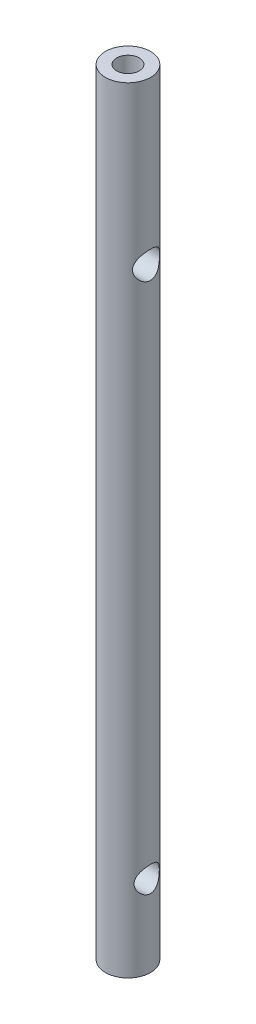
ISO-10303-21;
HEADER;
FILE_DESCRIPTION(('STEP AP214'),'2;1');
FILE_NAME('part.step','',(''),(''),'','','');
FILE_SCHEMA(('AUTOMOTIVE_DESIGN { 1 0 10303 214 1 1 1 1 }'));
ENDSEC;
DATA;
#1=APPLICATION_CONTEXT('core data for automotive mechanical design processes');
#2=APPLICATION_PROTOCOL_DEFINITION('international standard','automotive_design',2000,#1);
#3=PRODUCT_CONTEXT('',#1,'mechanical');
#4=PRODUCT('Part','Part','',(#3));
#5=PRODUCT_RELATED_PRODUCT_CATEGORY('part','',(#4));
#6=PRODUCT_DEFINITION_FORMATION('','',#4);
#7=PRODUCT_DEFINITION_CONTEXT('part definition',#1,'design');
#8=PRODUCT_DEFINITION('design','',#6,#7);
#9=PRODUCT_DEFINITION_SHAPE('','',#8);
#10=(LENGTH_UNIT() NAMED_UNIT(*) SI_UNIT(.MILLI.,.METRE.));
#11=(NAMED_UNIT(*) PLANE_ANGLE_UNIT() SI_UNIT($,.RADIAN.));
#12=(NAMED_UNIT(*) SI_UNIT($,.STERADIAN.) SOLID_ANGLE_UNIT());
#13=UNCERTAINTY_MEASURE_WITH_UNIT(LENGTH_MEASURE(1.E-05),#10,'distance_accuracy_value','');
#14=(GEOMETRIC_REPRESENTATION_CONTEXT(3) GLOBAL_UNCERTAINTY_ASSIGNED_CONTEXT((#13)) GLOBAL_UNIT_ASSIGNED_CONTEXT((#10,
#11,#12)) REPRESENTATION_CONTEXT('',''));
#15=CARTESIAN_POINT('',(0.,0.,0.));
#16=DIRECTION('',(0.,0.,1.));
#17=DIRECTION('',(1.,0.,0.));
#18=AXIS2_PLACEMENT_3D('',#15,#16,#17);
#19=CARTESIAN_POINT('',(0.,86.,0.));
#20=DIRECTION('',(0.,-1.,0.));
#21=DIRECTION('',(0.,0.,-1.));
#22=AXIS2_PLACEMENT_3D('',#19,#20,#21);
#23=CYLINDRICAL_SURFACE('',#22,2.5);
#24=CARTESIAN_POINT('',(0.,86.,0.));
#25=DIRECTION('',(0.,1.,0.));
#26=DIRECTION('',(0.,0.,1.));
#27=AXIS2_PLACEMENT_3D('',#24,#25,#26);
#28=CIRCLE('',#27,2.5);
#29=CARTESIAN_POINT('',(0.,86.,2.5));
#30=VERTEX_POINT('',#29);
#31=EDGE_CURVE('E11',#30,#30,#28,.T.);
#32=ORIENTED_EDGE('',*,*,#31,.F.);
#33=EDGE_LOOP('',(#32));
#34=FACE_BOUND('',#33,.T.);
#35=CARTESIAN_POINT('',(0.,0.,0.));
#36=DIRECTION('',(0.,1.,0.));
#37=DIRECTION('',(0.,0.,1.));
#38=AXIS2_PLACEMENT_3D('',#35,#36,#37);
#39=CIRCLE('',#38,2.5);
#40=CARTESIAN_POINT('',(0.,0.,2.5));
#41=VERTEX_POINT('',#40);
#42=EDGE_CURVE('E54',#41,#41,#39,.T.);
#43=ORIENTED_EDGE('',*,*,#42,.T.);
#44=EDGE_LOOP('',(#43));
#45=FACE_BOUND('',#44,.T.);
#46=CARTESIAN_POINT('',(-2.0712315177208,9.,1.4));
#47=CARTESIAN_POINT('',(-2.07123909027661,9.07149305818102,1.39999468319371));
#48=CARTESIAN_POINT('',(-2.07499216344643,9.1430423488181,1.39448531730428));
#49=CARTESIAN_POINT('',(-2.0894066044965,9.28382671417558,1.37278461207756));
#50=CARTESIAN_POINT('',(-2.10007910698716,9.3530578694328,1.35657605504756));
#51=CARTESIAN_POINT('',(-2.12668081601244,9.48688230197185,1.31447255275517));
#52=CARTESIAN_POINT('',(-2.14257607147103,9.55150233620222,1.28864002767649));
#53=CARTESIAN_POINT('',(-2.17777641320474,9.67546367634536,1.22821404175421));
#54=CARTESIAN_POINT('',(-2.19708229149844,9.73480375131692,1.19361854515251));
#55=CARTESIAN_POINT('',(-2.23939093134246,9.85337944274733,1.11240086919897));
#56=CARTESIAN_POINT('',(-2.26256898625041,9.91194874375592,1.0648968784294));
#57=CARTESIAN_POINT('',(-2.30860407960788,10.0208272895273,0.961029282380257));
#58=CARTESIAN_POINT('',(-2.33146090987448,10.0711313847504,0.904660196284242));
#59=CARTESIAN_POINT('',(-2.37672701302561,10.1665117485892,0.77849119350021));
#60=CARTESIAN_POINT('',(-2.39891099211563,10.2107104463267,0.707939182930364));
#61=CARTESIAN_POINT('',(-2.43793310010818,10.2862999198937,0.558922788850326));
#62=CARTESIAN_POINT('',(-2.45477544960247,10.317700813297,0.480464717091154));
#63=CARTESIAN_POINT('',(-2.47993061094345,10.3639641900332,0.324970269129105));
#64=CARTESIAN_POINT('',(-2.48885022247389,10.380012436191,0.248387259114564));
#65=CARTESIAN_POINT('',(-2.49947179300883,10.399080315561,0.0931438475208975));
#66=CARTESIAN_POINT('',(-2.50117947189874,10.402110273794,0.0144851420512028));
#67=CARTESIAN_POINT('',(-2.49741063590009,10.3953715250593,-0.1335036943637));
#68=CARTESIAN_POINT('',(-2.49269313390675,10.386955146487,-0.20292040454589));
#69=CARTESIAN_POINT('',(-2.47783425927899,10.3600691646916,-0.339165782252744));
#70=CARTESIAN_POINT('',(-2.46769246726723,10.3415987841444,-0.405994249239684));
#71=CARTESIAN_POINT('',(-2.4427551577396,10.2951598111377,-0.536080406729807));
#72=CARTESIAN_POINT('',(-2.4279144313585,10.2670987280334,-0.599296052666946));
#73=CARTESIAN_POINT('',(-2.39482686442995,10.2024829380585,-0.720236590951683));
#74=CARTESIAN_POINT('',(-2.37657897056834,10.1659256037432,-0.777959776970986));
#75=CARTESIAN_POINT('',(-2.33591784545606,10.0807701939362,-0.893092050102154));
#76=CARTESIAN_POINT('',(-2.31326717792671,10.0312886393317,-0.949763749983229));
#77=CARTESIAN_POINT('',(-2.26746872099475,9.92399685698432,-1.05444647934278));
#78=CARTESIAN_POINT('',(-2.24432041804225,9.86617763550909,-1.10244802885367));
#79=CARTESIAN_POINT('',(-2.19768244847907,9.73738651698853,-1.19290176928092));
#80=CARTESIAN_POINT('',(-2.17436166221399,9.66569124777934,-1.23442118013153));
#81=CARTESIAN_POINT('',(-2.13303244837663,9.51483579369217,-1.30454631584211));
#82=CARTESIAN_POINT('',(-2.11501787368352,9.43568438805092,-1.33316700411328));
#83=CARTESIAN_POINT('',(-2.08857712770776,9.27863742875881,-1.37419174284665));
#84=CARTESIAN_POINT('',(-2.07949849650391,9.20114913546989,-1.38771113359608));
#85=CARTESIAN_POINT('',(-2.07024252394322,9.04451448637818,-1.40149115934204));
#86=CARTESIAN_POINT('',(-2.07005392393355,8.96537035474844,-1.40176856446748));
#87=CARTESIAN_POINT('',(-2.07791118659503,8.82074590735636,-1.39007544836672));
#88=CARTESIAN_POINT('',(-2.08469887056476,8.75503123351856,-1.37997641339976));
#89=CARTESIAN_POINT('',(-2.1036892891987,8.62642581881794,-1.35084848453689));
#90=CARTESIAN_POINT('',(-2.11589458105879,8.56353642698793,-1.33181537337268));
#91=CARTESIAN_POINT('',(-2.14487716324909,8.43937660651972,-1.28463735606884));
#92=CARTESIAN_POINT('',(-2.16181942272859,8.37827456872713,-1.25615501532558));
#93=CARTESIAN_POINT('',(-2.19829747035133,8.26135073088326,-1.19116610768106));
#94=CARTESIAN_POINT('',(-2.217834506994,8.20553149498034,-1.15465567241351));
#95=CARTESIAN_POINT('',(-2.2611705573493,8.09107399297491,-1.06763311047891));
#96=CARTESIAN_POINT('',(-2.28513997238521,8.03349688357636,-1.01580388057815));
#97=CARTESIAN_POINT('',(-2.33198930697728,7.92741440477194,-0.903080490366977));
#98=CARTESIAN_POINT('',(-2.35486851823294,7.87891487470513,-0.842180540046623));
#99=CARTESIAN_POINT('',(-2.39854148802533,7.78979549528682,-0.708660318798825));
#100=CARTESIAN_POINT('',(-2.4191445091946,7.74977530760619,-0.635572389117808));
#101=CARTESIAN_POINT('',(-2.45430599884859,7.68302391244226,-0.482229111511989));
#102=CARTESIAN_POINT('',(-2.46887091730175,7.65627851861898,-0.401981523586639));
#103=CARTESIAN_POINT('',(-2.48903333323452,7.61960365224116,-0.245519989486454));
#104=CARTESIAN_POINT('',(-2.49540227664679,7.60822148410958,-0.16974680231517));
#105=CARTESIAN_POINT('',(-2.50110493965155,7.598020409181,-0.0171105012640225));
#106=CARTESIAN_POINT('',(-2.50044267835331,7.59919432519939,0.0597519648806884));
#107=CARTESIAN_POINT('',(-2.49256668834391,7.61330789884316,0.204646154490178));
#108=CARTESIAN_POINT('',(-2.48597775332027,7.62512563091504,0.272826181767548));
#109=CARTESIAN_POINT('',(-2.46771925049767,7.65842190207958,0.406059666430544));
#110=CARTESIAN_POINT('',(-2.45604909721075,7.67990155448517,0.471112762553249));
#111=CARTESIAN_POINT('',(-2.42817305763834,7.73250757625947,0.598643444758249));
#112=CARTESIAN_POINT('',(-2.41183498638457,7.76391844441902,0.660973787375967));
#113=CARTESIAN_POINT('',(-2.37612364901374,7.83513426492776,0.779669163365705));
#114=CARTESIAN_POINT('',(-2.35674921381647,7.87494245251754,0.83603188498207));
#115=CARTESIAN_POINT('',(-2.31405884083484,7.967172198853,0.948231547221909));
#116=CARTESIAN_POINT('',(-2.29054726854213,8.02052624689521,1.0032284663229));
#117=CARTESIAN_POINT('',(-2.24375509828595,8.13559253378091,1.10392650240057));
#118=CARTESIAN_POINT('',(-2.22047483287436,8.1973153380223,1.1496156830603));
#119=CARTESIAN_POINT('',(-2.17497515433628,8.33299014633894,1.23366585224565));
#120=CARTESIAN_POINT('',(-2.15296251073804,8.40750965291664,1.27123191090056));
#121=CARTESIAN_POINT('',(-2.11541950336875,8.5633715776248,1.33278706633758));
#122=CARTESIAN_POINT('',(-2.09986899293023,8.64469182634087,1.35681844404485));
#123=CARTESIAN_POINT('',(-2.08320935066708,8.77256134532692,1.38215120962618));
#124=CARTESIAN_POINT('',(-2.07874741035379,8.81766566258248,1.38882612431042));
#125=CARTESIAN_POINT('',(-2.07275619065605,8.90850567593789,1.39775203973217));
#126=CARTESIAN_POINT('',(-2.07122667095431,8.95424131998992,1.40000340298826));
#127=CARTESIAN_POINT('',(-2.0712315177208,9.,1.4));
#128=B_SPLINE_CURVE_WITH_KNOTS('',3,(#46,#47,#48,#49,#50,#51,#52,#53,#54,#55,#56,#57,#58,#59,
#60,#61,#62,#63,#64,#65,#66,#67,#68,#69,#70,#71,#72,#73,#74,#75,#76,#77,#78,#79,#80,#81,#82,#83,
#84,#85,#86,#87,#88,#89,#90,#91,#92,#93,#94,#95,#96,#97,#98,#99,#100,#101,#102,#103,#104,#105,
#106,#107,#108,#109,#110,#111,#112,#113,#114,#115,#116,#117,#118,#119,#120,#121,#122,#123,#124,
#125,#126,#127),.UNSPECIFIED.,.T.,.F.,(4,2,2,2,2,2,2,2,2,2,2,2,2,2,2,2,2,2,2,2,2,2,2,2,2,2,2,2,
2,2,2,2,2,2,2,2,2,2,2,2,4),(0.,0.21428434427757,0.428914369462877,0.642175895388673,
0.855487010395085,1.09121484750513,1.32708899969181,1.58418527370338,1.84107789872845,
2.07597681951216,2.31068940362332,2.51994838011554,2.72922353774098,2.94057667553583,
3.15199526093704,3.3867410383065,3.62174195379837,3.87862268845024,4.1352046517224,
4.3712339977998,4.60696441984678,4.80654964641286,5.00622918068223,5.21398587133405,
5.42184289053263,5.66408435623974,5.90648111717165,6.16256670998296,6.4183780400314,
6.64774121453456,6.87697328973899,7.08455097277193,7.292152580463,7.50634223985327,
7.72061457144108,7.960065215667,8.19982102661613,8.45736042768886,8.71409077568857,
8.8512533570458,8.98840469719605),.UNSPECIFIED.);
#129=CARTESIAN_POINT('',(-2.0712315177208,9.,1.4));
#130=VERTEX_POINT('',#129);
#131=EDGE_CURVE('E84',#130,#130,#128,.T.);
#132=ORIENTED_EDGE('',*,*,#131,.F.);
#133=EDGE_LOOP('',(#132));
#134=FACE_BOUND('',#133,.T.);
#135=CARTESIAN_POINT('',(2.0712315177208,9.,1.4));
#136=CARTESIAN_POINT('',(2.07123909027661,8.92850694181898,1.39999468319371));
#137=CARTESIAN_POINT('',(2.07499216344643,8.8569576511819,1.39448531730428));
#138=CARTESIAN_POINT('',(2.0894066044965,8.71617328582442,1.37278461207756));
#139=CARTESIAN_POINT('',(2.10007910698716,8.6469421305672,1.35657605504756));
#140=CARTESIAN_POINT('',(2.12668081601244,8.51311769802815,1.31447255275517));
#141=CARTESIAN_POINT('',(2.14257607147103,8.44849766379778,1.28864002767649));
#142=CARTESIAN_POINT('',(2.17777641320474,8.32453632365463,1.22821404175421));
#143=CARTESIAN_POINT('',(2.19708229149844,8.26519624868308,1.19361854515251));
#144=CARTESIAN_POINT('',(2.23939093134246,8.14662055725266,1.11240086919897));
#145=CARTESIAN_POINT('',(2.26256898625041,8.08805125624408,1.0648968784294));
#146=CARTESIAN_POINT('',(2.30860407960788,7.97917271047271,0.961029282380257));
#147=CARTESIAN_POINT('',(2.33146090987448,7.92886861524961,0.904660196284242));
#148=CARTESIAN_POINT('',(2.37672701302561,7.83348825141077,0.778491193500209));
#149=CARTESIAN_POINT('',(2.39891099211563,7.78928955367331,0.707939182930363));
#150=CARTESIAN_POINT('',(2.43793310010818,7.71370008010626,0.558922788850325));
#151=CARTESIAN_POINT('',(2.45477544960247,7.68229918670298,0.480464717091154));
#152=CARTESIAN_POINT('',(2.47993061094345,7.63603580996681,0.324970269129105));
#153=CARTESIAN_POINT('',(2.48885022247389,7.61998756380899,0.248387259114565));
#154=CARTESIAN_POINT('',(2.49947179300883,7.60091968443898,0.0931438475208979));
#155=CARTESIAN_POINT('',(2.50117947189874,7.59788972620605,0.0144851420512029));
#156=CARTESIAN_POINT('',(2.49741063590009,7.60462847494071,-0.1335036943637));
#157=CARTESIAN_POINT('',(2.49269313390675,7.61304485351298,-0.20292040454589));
#158=CARTESIAN_POINT('',(2.47783425927899,7.63993083530837,-0.339165782252744));
#159=CARTESIAN_POINT('',(2.46769246726723,7.65840121585556,-0.405994249239684));
#160=CARTESIAN_POINT('',(2.4427551577396,7.70484018886234,-0.536080406729807));
#161=CARTESIAN_POINT('',(2.4279144313585,7.73290127196657,-0.599296052666945));
#162=CARTESIAN_POINT('',(2.39482686442995,7.79751706194155,-0.720236590951683));
#163=CARTESIAN_POINT('',(2.37657897056834,7.83407439625683,-0.777959776970986));
#164=CARTESIAN_POINT('',(2.33591784545606,7.91922980606382,-0.893092050102154));
#165=CARTESIAN_POINT('',(2.31326717792671,7.96871136066831,-0.949763749983229));
#166=CARTESIAN_POINT('',(2.26746872099475,8.07600314301568,-1.05444647934278));
#167=CARTESIAN_POINT('',(2.24432041804225,8.13382236449091,-1.10244802885367));
#168=CARTESIAN_POINT('',(2.19768244847907,8.26261348301147,-1.19290176928092));
#169=CARTESIAN_POINT('',(2.17436166221399,8.33430875222066,-1.23442118013153));
#170=CARTESIAN_POINT('',(2.13303244837663,8.48516420630783,-1.30454631584211));
#171=CARTESIAN_POINT('',(2.11501787368352,8.56431561194908,-1.33316700411328));
#172=CARTESIAN_POINT('',(2.08857712770775,8.72136257124119,-1.37419174284665));
#173=CARTESIAN_POINT('',(2.07949849650391,8.79885086453011,-1.38771113359608));
#174=CARTESIAN_POINT('',(2.07024252394322,8.95548551362182,-1.40149115934204));
#175=CARTESIAN_POINT('',(2.07005392393355,9.03462964525155,-1.40176856446748));
#176=CARTESIAN_POINT('',(2.07791118659503,9.17925409264364,-1.39007544836672));
#177=CARTESIAN_POINT('',(2.08469887056476,9.24496876648144,-1.37997641339976));
#178=CARTESIAN_POINT('',(2.1036892891987,9.37357418118206,-1.35084848453689));
#179=CARTESIAN_POINT('',(2.11589458105879,9.43646357301207,-1.33181537337268));
#180=CARTESIAN_POINT('',(2.14487716324909,9.56062339348028,-1.28463735606884));
#181=CARTESIAN_POINT('',(2.16181942272859,9.62172543127287,-1.25615501532558));
#182=CARTESIAN_POINT('',(2.19829747035133,9.73864926911674,-1.19116610768106));
#183=CARTESIAN_POINT('',(2.217834506994,9.79446850501966,-1.15465567241351));
#184=CARTESIAN_POINT('',(2.2611705573493,9.90892600702509,-1.0676331104789));
#185=CARTESIAN_POINT('',(2.28513997238522,9.96650311642364,-1.01580388057815));
#186=CARTESIAN_POINT('',(2.33198930697728,10.0725855952281,-0.903080490366976));
#187=CARTESIAN_POINT('',(2.35486851823294,10.1210851252949,-0.842180540046623));
#188=CARTESIAN_POINT('',(2.39854148802533,10.2102045047132,-0.708660318798825));
#189=CARTESIAN_POINT('',(2.4191445091946,10.2502246923938,-0.635572389117807));
#190=CARTESIAN_POINT('',(2.45430599884859,10.3169760875577,-0.482229111511988));
#191=CARTESIAN_POINT('',(2.46887091730175,10.343721481381,-0.401981523586639));
#192=CARTESIAN_POINT('',(2.48903333323452,10.3803963477588,-0.245519989486455));
#193=CARTESIAN_POINT('',(2.49540227664679,10.3917785158904,-0.16974680231517));
#194=CARTESIAN_POINT('',(2.50110493965155,10.401979590819,-0.0171105012640226));
#195=CARTESIAN_POINT('',(2.50044267835331,10.4008056748006,0.0597519648806881));
#196=CARTESIAN_POINT('',(2.49256668834391,10.3866921011568,0.204646154490177));
#197=CARTESIAN_POINT('',(2.48597775332027,10.374874369085,0.272826181767547));
#198=CARTESIAN_POINT('',(2.46771925049767,10.3415780979204,0.406059666430543));
#199=CARTESIAN_POINT('',(2.45604909721075,10.3200984455148,0.471112762553248));
#200=CARTESIAN_POINT('',(2.42817305763834,10.2674924237405,0.598643444758249));
#201=CARTESIAN_POINT('',(2.41183498638457,10.236081555581,0.660973787375967));
#202=CARTESIAN_POINT('',(2.37612364901374,10.1648657350722,0.779669163365705));
#203=CARTESIAN_POINT('',(2.35674921381647,10.1250575474825,0.836031884982069));
#204=CARTESIAN_POINT('',(2.31405884083484,10.032827801147,0.948231547221908));
#205=CARTESIAN_POINT('',(2.29054726854213,9.97947375310478,1.0032284663229));
#206=CARTESIAN_POINT('',(2.24375509828595,9.86440746621908,1.10392650240057));
#207=CARTESIAN_POINT('',(2.22047483287436,9.8026846619777,1.1496156830603));
#208=CARTESIAN_POINT('',(2.17497515433628,9.66700985366106,1.23366585224565));
#209=CARTESIAN_POINT('',(2.15296251073804,9.59249034708336,1.27123191090056));
#210=CARTESIAN_POINT('',(2.11541950336875,9.4366284223752,1.33278706633758));
#211=CARTESIAN_POINT('',(2.09986899293023,9.35530817365913,1.35681844404485));
#212=CARTESIAN_POINT('',(2.08320935066708,9.22743865467308,1.38215120962618));
#213=CARTESIAN_POINT('',(2.07874741035379,9.18233433741752,1.38882612431042));
#214=CARTESIAN_POINT('',(2.07275619065605,9.09149432406211,1.39775203973217));
#215=CARTESIAN_POINT('',(2.07122667095431,9.04575868001008,1.40000340298826));
#216=CARTESIAN_POINT('',(2.0712315177208,9.,1.4));
#217=B_SPLINE_CURVE_WITH_KNOTS('',3,(#135,#136,#137,#138,#139,#140,#141,#142,#143,#144,#145,
#146,#147,#148,#149,#150,#151,#152,#153,#154,#155,#156,#157,#158,#159,#160,#161,#162,#163,#164,
#165,#166,#167,#168,#169,#170,#171,#172,#173,#174,#175,#176,#177,#178,#179,#180,#181,#182,#183,
#184,#185,#186,#187,#188,#189,#190,#191,#192,#193,#194,#195,#196,#197,#198,#199,#200,#201,#202,
#203,#204,#205,#206,#207,#208,#209,#210,#211,#212,#213,#214,#215,#216),.UNSPECIFIED.,.T.,.F.,(4,
2,2,2,2,2,2,2,2,2,2,2,2,2,2,2,2,2,2,2,2,2,2,2,2,2,2,2,2,2,2,2,2,2,2,2,2,2,2,2,4),(0.,
0.21428434427757,0.428914369462877,0.642175895388673,0.855487010395085,1.09121484750513,
1.32708899969181,1.58418527370338,1.84107789872845,2.07597681951216,2.31068940362332,
2.51994838011554,2.72922353774098,2.94057667553583,3.15199526093704,3.3867410383065,
3.62174195379837,3.87862268845024,4.1352046517224,4.3712339977998,4.60696441984678,
4.80654964641286,5.00622918068223,5.21398587133405,5.42184289053263,5.66408435623975,
5.90648111717165,6.16256670998296,6.4183780400314,6.64774121453456,6.87697328973899,
7.08455097277193,7.292152580463,7.50634223985327,7.72061457144108,7.96006521566701,
8.19982102661613,8.45736042768886,8.71409077568857,8.8512533570458,8.98840469719605),.UNSPECIFIED.);
#218=CARTESIAN_POINT('',(2.0712315177208,9.,1.4));
#219=VERTEX_POINT('',#218);
#220=EDGE_CURVE('E91',#219,#219,#217,.T.);
#221=ORIENTED_EDGE('',*,*,#220,.F.);
#222=EDGE_LOOP('',(#221));
#223=FACE_BOUND('',#222,.T.);
#224=CARTESIAN_POINT('',(-2.,68.,1.5));
#225=CARTESIAN_POINT('',(-1.99999416642511,68.0754789752896,1.50000404108592));
#226=CARTESIAN_POINT('',(-2.00433633903481,68.1509384340798,1.49426852824014));
#227=CARTESIAN_POINT('',(-2.02092590613883,68.2993239039622,1.47174965152787));
#228=CARTESIAN_POINT('',(-2.03318155043097,68.3722471873851,1.45495475788936));
#229=CARTESIAN_POINT('',(-2.0636233903473,68.5130836416773,1.41143486335796));
#230=CARTESIAN_POINT('',(-2.0817666618312,68.5810288380353,1.3847815450315));
#231=CARTESIAN_POINT('',(-2.12185904995836,68.7114374533679,1.32252909283019));
#232=CARTESIAN_POINT('',(-2.14380930122416,68.7738992296951,1.28692729054693));
#233=CARTESIAN_POINT('',(-2.19228594587542,68.8999490166641,1.20271292747644));
#234=CARTESIAN_POINT('',(-2.21904371037662,68.9627409571239,1.15304179435288));
#235=CARTESIAN_POINT('',(-2.27226229431061,69.0797647627417,1.04426801309985));
#236=CARTESIAN_POINT('',(-2.29872287517103,69.1339901516708,0.985158296729615));
#237=CARTESIAN_POINT('',(-2.35175567858734,69.2381338097097,0.851442367411705));
#238=CARTESIAN_POINT('',(-2.37803133577818,69.2869544636697,0.775851995162547));
#239=CARTESIAN_POINT('',(-2.42443786983179,69.3708097224444,0.615654228271658));
#240=CARTESIAN_POINT('',(-2.44457437988735,69.4058569741227,0.531055196626334));
#241=CARTESIAN_POINT('',(-2.4747098780044,69.4575959228126,0.363771406742671));
#242=CARTESIAN_POINT('',(-2.4854930393917,69.4757203609673,0.281674698130917));
#243=CARTESIAN_POINT('',(-2.49874939277545,69.4979428028631,0.114970509382707));
#244=CARTESIAN_POINT('',(-2.50123038813307,69.502053978,0.0303654624001521));
#245=CARTESIAN_POINT('',(-2.49783372711539,69.4963862526575,-0.127637283737311));
#246=CARTESIAN_POINT('',(-2.49295437513726,69.4882664738307,-0.201123832865635));
#247=CARTESIAN_POINT('',(-2.47707997553857,69.4615202043519,-0.345464269151769));
#248=CARTESIAN_POINT('',(-2.46608447529309,69.4428929360928,-0.416317961051203));
#249=CARTESIAN_POINT('',(-2.43884907201719,69.3958344372962,-0.554056780469081));
#250=CARTESIAN_POINT('',(-2.42257910450824,69.367346938861,-0.620916491037617));
#251=CARTESIAN_POINT('',(-2.38609637638748,69.3016153837744,-0.748988660115611));
#252=CARTESIAN_POINT('',(-2.36588259201812,69.264369052941,-0.810199646208013));
#253=CARTESIAN_POINT('',(-2.32037925976362,69.1771609071955,-0.9330742671432));
#254=CARTESIAN_POINT('',(-2.2947718295215,69.1262116882643,-0.993918663198191));
#255=CARTESIAN_POINT('',(-2.24255554245601,69.0155958821398,-1.10671465909274));
#256=CARTESIAN_POINT('',(-2.21594536703375,68.9559174965255,-1.15865401308339));
#257=CARTESIAN_POINT('',(-2.16111075123946,68.8213465938364,-1.25824837767417));
#258=CARTESIAN_POINT('',(-2.13305661385124,68.7454924234605,-1.30470933188632));
#259=CARTESIAN_POINT('',(-2.08250879557267,68.5852937683634,-1.38397217194232));
#260=CARTESIAN_POINT('',(-2.0600049029882,68.5009652838743,-1.41679921962189));
#261=CARTESIAN_POINT('',(-2.02895865196731,68.3476063681046,-1.46077497064843));
#262=CARTESIAN_POINT('',(-2.01833888618315,68.2799593677033,-1.47527903312665));
#263=CARTESIAN_POINT('',(-2.00392150777558,68.1426263897005,-1.49480872755284));
#264=CARTESIAN_POINT('',(-2.00011596115116,68.0729428795154,-1.49984538302907));
#265=CARTESIAN_POINT('',(-1.99988914321323,67.9334483175643,-1.50014781114183));
#266=CARTESIAN_POINT('',(-2.00347810223984,67.8636372227848,-1.49540004697659));
#267=CARTESIAN_POINT('',(-2.01751520788652,67.7260126562514,-1.47640290574941));
#268=CARTESIAN_POINT('',(-2.02796877613213,67.6582008077597,-1.4621460183014));
#269=CARTESIAN_POINT('',(-2.054317683331,67.5262854205202,-1.42488312618657));
#270=CARTESIAN_POINT('',(-2.07020622092812,67.4621773634678,-1.40188805257362));
#271=CARTESIAN_POINT('',(-2.10571539417586,67.3385222842698,-1.34796261057073));
#272=CARTESIAN_POINT('',(-2.12533743689998,67.278976993634,-1.31702924888213));
#273=CARTESIAN_POINT('',(-2.17036819177736,67.1547599174878,-1.24167439558513));
#274=CARTESIAN_POINT('',(-2.19618239397368,67.0910991649034,-1.19582663060304));
#275=CARTESIAN_POINT('',(-2.2482175480362,66.9717145151505,-1.09487395518702));
#276=CARTESIAN_POINT('',(-2.27443886711454,66.9159983078309,-1.03976018672403));
#277=CARTESIAN_POINT('',(-2.32835625910913,66.8067759926496,-0.913274837212774));
#278=CARTESIAN_POINT('',(-2.35580075875869,66.7544992733942,-0.840721108780202));
#279=CARTESIAN_POINT('',(-2.40537639133458,66.6630972231633,-0.686103100868033));
#280=CARTESIAN_POINT('',(-2.4275110444941,66.6239631721591,-0.604045176134714));
#281=CARTESIAN_POINT('',(-2.46252280092775,66.5631317965686,-0.438840232972149));
#282=CARTESIAN_POINT('',(-2.47595588067329,66.5403737722089,-0.356205963651269));
#283=CARTESIAN_POINT('',(-2.494407389061,66.5092853971537,-0.187383063890867));
#284=CARTESIAN_POINT('',(-2.49943534582737,66.5009387092824,-0.101198571781977));
#285=CARTESIAN_POINT('',(-2.50040600461976,66.4993253914141,0.0598120232009771));
#286=CARTESIAN_POINT('',(-2.49747057186327,66.504196665437,0.1346205835897));
#287=CARTESIAN_POINT('',(-2.48512948412095,66.5248938243816,0.282148755978767));
#288=CARTESIAN_POINT('',(-2.47572375706639,66.5407198313216,0.354868344701906));
#289=CARTESIAN_POINT('',(-2.45149427526962,66.5822195715838,0.49514548197879));
#290=CARTESIAN_POINT('',(-2.43675966858906,66.6077315961292,0.562767032608825));
#291=CARTESIAN_POINT('',(-2.40303337447155,66.6676405945547,0.69278197199998));
#292=CARTESIAN_POINT('',(-2.38404073252268,66.7020395608596,0.755174184199828));
#293=CARTESIAN_POINT('',(-2.34093432659381,66.7829251965687,0.880263645295939));
#294=CARTESIAN_POINT('',(-2.31648844639149,66.8303187090169,0.942258690439929));
#295=CARTESIAN_POINT('',(-2.26601907350661,66.9337530337177,1.05789751536306));
#296=CARTESIAN_POINT('',(-2.23999385274509,66.9898034256079,1.11153190956915));
#297=CARTESIAN_POINT('',(-2.18528165666205,67.1172855621777,1.2159097535057));
#298=CARTESIAN_POINT('',(-2.15667566270901,67.1897664861655,1.26542406663367));
#299=CARTESIAN_POINT('',(-2.10376464485146,67.3434848527665,1.35156817210324));
#300=CARTESIAN_POINT('',(-2.07945738811052,67.4247177139814,1.3882046632266));
#301=CARTESIAN_POINT('',(-2.0408000304796,67.5870642851372,1.44437116535132));
#302=CARTESIAN_POINT('',(-2.02577665830138,67.6675952359612,1.46509526060187));
#303=CARTESIAN_POINT('',(-2.00539032320036,67.8320973947037,1.49289268240426));
#304=CARTESIAN_POINT('',(-2.00000648744643,67.9160607657587,1.49999550595837));
#305=CARTESIAN_POINT('',(-2.,68.,1.5));
#306=B_SPLINE_CURVE_WITH_KNOTS('',3,(#224,#225,#226,#227,#228,#229,#230,#231,#232,#233,#234,
#235,#236,#237,#238,#239,#240,#241,#242,#243,#244,#245,#246,#247,#248,#249,#250,#251,#252,#253,
#254,#255,#256,#257,#258,#259,#260,#261,#262,#263,#264,#265,#266,#267,#268,#269,#270,#271,#272,
#273,#274,#275,#276,#277,#278,#279,#280,#281,#282,#283,#284,#285,#286,#287,#288,#289,#290,#291,
#292,#293,#294,#295,#296,#297,#298,#299,#300,#301,#302,#303,#304,#305),.UNSPECIFIED.,.T.,.F.,(4,
2,2,2,2,2,2,2,2,2,2,2,2,2,2,2,2,2,2,2,2,2,2,2,2,2,2,2,2,2,2,2,2,2,2,2,2,2,2,2,4),(0.,
0.22608524949339,0.45240657433077,0.677113624991881,0.901887762215938,1.15414462390001,
1.40659128601844,1.68630157736223,1.9657544327122,2.21853330858497,2.47107452602767,
2.69230130543182,2.91354445887945,3.13607155036377,3.35865648368878,3.60782810055849,
3.85733966656908,4.13576671140276,4.41367760154769,4.62276298054685,4.83160475643977,
5.04073566011181,5.25003193304128,5.45906724365494,5.6681814915466,5.91499438482001,
6.16204457978454,6.44121828011588,6.72020638384847,6.97891479383337,7.23732973022726,
7.46129321849399,7.68525920139648,7.90563970188756,8.12606965394584,8.37042963549486,
8.61506198741954,8.89071695766603,9.16622832484804,9.41820120134353,9.66962780912278),.UNSPECIFIED.);
#307=CARTESIAN_POINT('',(-2.,68.,1.5));
#308=VERTEX_POINT('',#307);
#309=EDGE_CURVE('E137',#308,#308,#306,.T.);
#310=ORIENTED_EDGE('',*,*,#309,.F.);
#311=EDGE_LOOP('',(#310));
#312=FACE_BOUND('',#311,.T.);
#313=CARTESIAN_POINT('',(2.,68.,1.5));
#314=CARTESIAN_POINT('',(1.99999416642511,67.9245210247104,1.50000404108592));
#315=CARTESIAN_POINT('',(2.00433633903481,67.8490615659202,1.49426852824014));
#316=CARTESIAN_POINT('',(2.02092590613883,67.7006760960378,1.47174965152787));
#317=CARTESIAN_POINT('',(2.03318155043097,67.6277528126149,1.45495475788936));
#318=CARTESIAN_POINT('',(2.0636233903473,67.4869163583227,1.41143486335796));
#319=CARTESIAN_POINT('',(2.0817666618312,67.4189711619647,1.3847815450315));
#320=CARTESIAN_POINT('',(2.12185904995836,67.2885625466321,1.32252909283019));
#321=CARTESIAN_POINT('',(2.14380930122416,67.2261007703048,1.28692729054693));
#322=CARTESIAN_POINT('',(2.19228594587542,67.1000509833359,1.20271292747644));
#323=CARTESIAN_POINT('',(2.21904371037662,67.0372590428761,1.15304179435289));
#324=CARTESIAN_POINT('',(2.2722622943106,66.9202352372582,1.04426801309985));
#325=CARTESIAN_POINT('',(2.29872287517102,66.8660098483292,0.985158296729617));
#326=CARTESIAN_POINT('',(2.35175567858734,66.7618661902903,0.851442367411704));
#327=CARTESIAN_POINT('',(2.37803133577818,66.7130455363302,0.775851995162547));
#328=CARTESIAN_POINT('',(2.42443786983179,66.6291902775556,0.615654228271658));
#329=CARTESIAN_POINT('',(2.44457437988735,66.5941430258773,0.531055196626334));
#330=CARTESIAN_POINT('',(2.4747098780044,66.5424040771873,0.363771406742671));
#331=CARTESIAN_POINT('',(2.4854930393917,66.5242796390327,0.281674698130917));
#332=CARTESIAN_POINT('',(2.49874939277545,66.5020571971369,0.114970509382707));
#333=CARTESIAN_POINT('',(2.50123038813307,66.4979460219999,0.0303654624001521));
#334=CARTESIAN_POINT('',(2.49783372711539,66.5036137473425,-0.127637283737311));
#335=CARTESIAN_POINT('',(2.49295437513726,66.5117335261693,-0.201123832865635));
#336=CARTESIAN_POINT('',(2.47707997553857,66.5384797956481,-0.345464269151769));
#337=CARTESIAN_POINT('',(2.46608447529309,66.5571070639072,-0.416317961051203));
#338=CARTESIAN_POINT('',(2.43884907201719,66.6041655627038,-0.554056780469079));
#339=CARTESIAN_POINT('',(2.42257910450824,66.632653061139,-0.620916491037613));
#340=CARTESIAN_POINT('',(2.38609637638748,66.6983846162255,-0.748988660115607));
#341=CARTESIAN_POINT('',(2.36588259201812,66.735630947059,-0.810199646208011));
#342=CARTESIAN_POINT('',(2.32037925976362,66.8228390928044,-0.9330742671432));
#343=CARTESIAN_POINT('',(2.2947718295215,66.8737883117357,-0.993918663198191));
#344=CARTESIAN_POINT('',(2.24255554245601,66.9844041178602,-1.10671465909274));
#345=CARTESIAN_POINT('',(2.21594536703375,67.0440825034745,-1.15865401308339));
#346=CARTESIAN_POINT('',(2.16111075123946,67.1786534061635,-1.25824837767417));
#347=CARTESIAN_POINT('',(2.13305661385124,67.2545075765395,-1.30470933188632));
#348=CARTESIAN_POINT('',(2.08250879557267,67.4147062316366,-1.38397217194232));
#349=CARTESIAN_POINT('',(2.0600049029882,67.4990347161256,-1.41679921962189));
#350=CARTESIAN_POINT('',(2.02895865196731,67.6523936318954,-1.46077497064843));
#351=CARTESIAN_POINT('',(2.01833888618315,67.7200406322966,-1.47527903312665));
#352=CARTESIAN_POINT('',(2.00392150777558,67.8573736102995,-1.49480872755284));
#353=CARTESIAN_POINT('',(2.00011596115116,67.9270571204845,-1.49984538302907));
#354=CARTESIAN_POINT('',(1.99988914321323,68.0665516824357,-1.50014781114183));
#355=CARTESIAN_POINT('',(2.00347810223984,68.1363627772152,-1.49540004697659));
#356=CARTESIAN_POINT('',(2.01751520788652,68.2739873437485,-1.47640290574941));
#357=CARTESIAN_POINT('',(2.02796877613213,68.3417991922402,-1.4621460183014));
#358=CARTESIAN_POINT('',(2.054317683331,68.4737145794798,-1.42488312618657));
#359=CARTESIAN_POINT('',(2.07020622092812,68.5378226365322,-1.40188805257362));
#360=CARTESIAN_POINT('',(2.10571539417586,68.6614777157302,-1.34796261057073));
#361=CARTESIAN_POINT('',(2.12533743689998,68.721023006366,-1.31702924888213));
#362=CARTESIAN_POINT('',(2.17036819177736,68.8452400825122,-1.24167439558513));
#363=CARTESIAN_POINT('',(2.19618239397368,68.9089008350965,-1.19582663060304));
#364=CARTESIAN_POINT('',(2.2482175480362,69.0282854848494,-1.09487395518702));
#365=CARTESIAN_POINT('',(2.27443886711454,69.0840016921691,-1.03976018672403));
#366=CARTESIAN_POINT('',(2.32835625910913,69.1932240073504,-0.913274837212774));
#367=CARTESIAN_POINT('',(2.35580075875869,69.2455007266058,-0.840721108780202));
#368=CARTESIAN_POINT('',(2.40537639133458,69.3369027768366,-0.686103100868033));
#369=CARTESIAN_POINT('',(2.4275110444941,69.3760368278409,-0.604045176134714));
#370=CARTESIAN_POINT('',(2.46252280092775,69.4368682034314,-0.43884023297215));
#371=CARTESIAN_POINT('',(2.47595588067329,69.4596262277911,-0.35620596365127));
#372=CARTESIAN_POINT('',(2.494407389061,69.4907146028462,-0.187383063890868));
#373=CARTESIAN_POINT('',(2.49943534582737,69.4990612907176,-0.101198571781978));
#374=CARTESIAN_POINT('',(2.50040600461976,69.5006746085859,0.0598120232009771));
#375=CARTESIAN_POINT('',(2.49747057186327,69.495803334563,0.1346205835897));
#376=CARTESIAN_POINT('',(2.48512948412095,69.4751061756184,0.282148755978767));
#377=CARTESIAN_POINT('',(2.47572375706639,69.4592801686784,0.354868344701906));
#378=CARTESIAN_POINT('',(2.45149427526962,69.4177804284162,0.49514548197879));
#379=CARTESIAN_POINT('',(2.43675966858906,69.3922684038707,0.562767032608825));
#380=CARTESIAN_POINT('',(2.40303337447155,69.3323594054452,0.69278197199998));
#381=CARTESIAN_POINT('',(2.38404073252268,69.2979604391404,0.755174184199828));
#382=CARTESIAN_POINT('',(2.34093432659381,69.2170748034312,0.880263645295939));
#383=CARTESIAN_POINT('',(2.31648844639149,69.1696812909831,0.942258690439929));
#384=CARTESIAN_POINT('',(2.26601907350661,69.0662469662823,1.05789751536306));
#385=CARTESIAN_POINT('',(2.23999385274509,69.0101965743921,1.11153190956915));
#386=CARTESIAN_POINT('',(2.18528165666205,68.8827144378223,1.2159097535057));
#387=CARTESIAN_POINT('',(2.15667566270901,68.8102335138345,1.26542406663367));
#388=CARTESIAN_POINT('',(2.10376464485146,68.6565151472335,1.35156817210324));
#389=CARTESIAN_POINT('',(2.07945738811052,68.5752822860186,1.3882046632266));
#390=CARTESIAN_POINT('',(2.0408000304796,68.4129357148628,1.44437116535132));
#391=CARTESIAN_POINT('',(2.02577665830138,68.3324047640388,1.46509526060187));
#392=CARTESIAN_POINT('',(2.00539032320036,68.1679026052963,1.49289268240426));
#393=CARTESIAN_POINT('',(2.00000648744643,68.0839392342413,1.49999550595837));
#394=CARTESIAN_POINT('',(2.,68.,1.5));
#395=B_SPLINE_CURVE_WITH_KNOTS('',3,(#313,#314,#315,#316,#317,#318,#319,#320,#321,#322,#323,
#324,#325,#326,#327,#328,#329,#330,#331,#332,#333,#334,#335,#336,#337,#338,#339,#340,#341,#342,
#343,#344,#345,#346,#347,#348,#349,#350,#351,#352,#353,#354,#355,#356,#357,#358,#359,#360,#361,
#362,#363,#364,#365,#366,#367,#368,#369,#370,#371,#372,#373,#374,#375,#376,#377,#378,#379,#380,
#381,#382,#383,#384,#385,#386,#387,#388,#389,#390,#391,#392,#393,#394),.UNSPECIFIED.,.T.,.F.,(4,
2,2,2,2,2,2,2,2,2,2,2,2,2,2,2,2,2,2,2,2,2,2,2,2,2,2,2,2,2,2,2,2,2,2,2,2,2,2,2,4),(0.,
0.22608524949339,0.45240657433077,0.677113624991881,0.901887762215938,1.15414462390001,
1.40659128601844,1.68630157736223,1.9657544327122,2.21853330858497,2.47107452602767,
2.69230130543182,2.91354445887945,3.13607155036377,3.35865648368878,3.60782810055849,
3.85733966656908,4.13576671140276,4.41367760154769,4.62276298054685,4.83160475643977,
5.04073566011181,5.25003193304128,5.45906724365494,5.6681814915466,5.91499438482001,
6.16204457978454,6.44121828011588,6.72020638384847,6.97891479383337,7.23732973022726,
7.46129321849399,7.68525920139648,7.90563970188756,8.12606965394584,8.37042963549486,
8.61506198741954,8.89071695766603,9.16622832484804,9.41820120134353,9.66962780912278),.UNSPECIFIED.);
#396=CARTESIAN_POINT('',(2.,68.,1.5));
#397=VERTEX_POINT('',#396);
#398=EDGE_CURVE('E45',#397,#397,#395,.T.);
#399=ORIENTED_EDGE('',*,*,#398,.F.);
#400=EDGE_LOOP('',(#399));
#401=FACE_BOUND('',#400,.T.);
#402=ADVANCED_FACE('F41',(#34,#45,#134,#223,#312,#401),#23,.T.);
#403=CARTESIAN_POINT('',(0.,86.,0.));
#404=DIRECTION('',(0.,1.,0.));
#405=DIRECTION('',(0.,0.,1.));
#406=AXIS2_PLACEMENT_3D('',#403,#404,#405);
#407=PLANE('',#406);
#408=CARTESIAN_POINT('',(0.,86.,0.));
#409=DIRECTION('',(0.,1.,0.));
#410=DIRECTION('',(0.,0.,1.));
#411=AXIS2_PLACEMENT_3D('',#408,#409,#410);
#412=CIRCLE('',#411,1.24999999999999);
#413=CARTESIAN_POINT('',(0.,86.,1.24999999999999));
#414=VERTEX_POINT('',#413);
#415=EDGE_CURVE('E72',#414,#414,#412,.T.);
#416=ORIENTED_EDGE('',*,*,#415,.F.);
#417=EDGE_LOOP('',(#416));
#418=FACE_BOUND('',#417,.T.);
#419=ORIENTED_EDGE('',*,*,#31,.T.);
#420=EDGE_LOOP('',(#419));
#421=FACE_BOUND('',#420,.T.);
#422=ADVANCED_FACE('F112',(#418,#421),#407,.T.);
#423=CARTESIAN_POINT('',(0.,0.,0.));
#424=DIRECTION('',(0.,1.,0.));
#425=DIRECTION('',(0.,0.,1.));
#426=AXIS2_PLACEMENT_3D('',#423,#424,#425);
#427=PLANE('',#426);
#428=CARTESIAN_POINT('',(0.,0.,0.));
#429=DIRECTION('',(0.,-1.,0.));
#430=DIRECTION('',(0.,0.,-1.));
#431=AXIS2_PLACEMENT_3D('',#428,#429,#430);
#432=CIRCLE('',#431,1.25);
#433=CARTESIAN_POINT('',(0.,0.,-1.25));
#434=VERTEX_POINT('',#433);
#435=EDGE_CURVE('E71',#434,#434,#432,.T.);
#436=ORIENTED_EDGE('',*,*,#435,.F.);
#437=EDGE_LOOP('',(#436));
#438=FACE_BOUND('',#437,.T.);
#439=ORIENTED_EDGE('',*,*,#42,.F.);
#440=EDGE_LOOP('',(#439));
#441=FACE_BOUND('',#440,.T.);
#442=ADVANCED_FACE('F111',(#438,#441),#427,.F.);
#443=CARTESIAN_POINT('',(0.,6.74892422621555,0.));
#444=DIRECTION('',(0.,-1.,0.));
#445=DIRECTION('',(0.,0.,-1.));
#446=AXIS2_PLACEMENT_3D('',#443,#444,#445);
#447=CONICAL_SURFACE('',#446,1.25,1.02974425867665);
#448=CARTESIAN_POINT('',(0.,7.5,0.));
#449=VERTEX_POINT('',#448);
#450=VERTEX_LOOP('',#449);
#451=FACE_BOUND('',#450,.T.);
#452=CARTESIAN_POINT('',(0.,6.74892422621555,0.));
#453=DIRECTION('',(0.,-1.,0.));
#454=DIRECTION('',(0.,0.,-1.));
#455=AXIS2_PLACEMENT_3D('',#452,#453,#454);
#456=CIRCLE('',#455,1.25);
#457=CARTESIAN_POINT('',(0.,6.74892422621555,-1.25));
#458=VERTEX_POINT('',#457);
#459=EDGE_CURVE('E75',#458,#458,#456,.T.);
#460=ORIENTED_EDGE('',*,*,#459,.T.);
#461=EDGE_LOOP('',(#460));
#462=FACE_BOUND('',#461,.T.);
#463=ADVANCED_FACE('F107',(#451,#462),#447,.F.);
#464=CARTESIAN_POINT('',(0.,0.,0.));
#465=DIRECTION('',(0.,-1.,0.));
#466=DIRECTION('',(0.,0.,-1.));
#467=AXIS2_PLACEMENT_3D('',#464,#465,#466);
#468=CYLINDRICAL_SURFACE('',#467,1.25);
#469=ORIENTED_EDGE('',*,*,#459,.F.);
#470=EDGE_LOOP('',(#469));
#471=FACE_BOUND('',#470,.T.);
#472=ORIENTED_EDGE('',*,*,#435,.T.);
#473=EDGE_LOOP('',(#472));
#474=FACE_BOUND('',#473,.T.);
#475=ADVANCED_FACE('F65',(#471,#474),#468,.F.);
#476=CARTESIAN_POINT('',(0.,79.2510757737845,0.));
#477=DIRECTION('',(0.,1.,0.));
#478=DIRECTION('',(0.,0.,1.));
#479=AXIS2_PLACEMENT_3D('',#476,#477,#478);
#480=CONICAL_SURFACE('',#479,1.25,1.02974425867665);
#481=CARTESIAN_POINT('',(0.,78.5,0.));
#482=VERTEX_POINT('',#481);
#483=VERTEX_LOOP('',#482);
#484=FACE_BOUND('',#483,.T.);
#485=CARTESIAN_POINT('',(0.,79.2510757737845,0.));
#486=DIRECTION('',(0.,1.,0.));
#487=DIRECTION('',(0.,0.,1.));
#488=AXIS2_PLACEMENT_3D('',#485,#486,#487);
#489=CIRCLE('',#488,1.25);
#490=CARTESIAN_POINT('',(0.,79.2510757737845,1.25));
#491=VERTEX_POINT('',#490);
#492=EDGE_CURVE('E69',#491,#491,#489,.T.);
#493=ORIENTED_EDGE('',*,*,#492,.T.);
#494=EDGE_LOOP('',(#493));
#495=FACE_BOUND('',#494,.T.);
#496=ADVANCED_FACE('F61',(#484,#495),#480,.F.);
#497=CARTESIAN_POINT('',(0.,86.,0.));
#498=DIRECTION('',(0.,1.,0.));
#499=DIRECTION('',(0.,0.,1.));
#500=AXIS2_PLACEMENT_3D('',#497,#498,#499);
#501=CYLINDRICAL_SURFACE('',#500,1.24999999999999);
#502=ORIENTED_EDGE('',*,*,#492,.F.);
#503=EDGE_LOOP('',(#502));
#504=FACE_BOUND('',#503,.T.);
#505=ORIENTED_EDGE('',*,*,#415,.T.);
#506=EDGE_LOOP('',(#505));
#507=FACE_BOUND('',#506,.T.);
#508=ADVANCED_FACE('F64',(#504,#507),#501,.F.);
#509=CARTESIAN_POINT('',(5.,9.,0.));
#510=DIRECTION('',(-1.,0.,0.));
#511=DIRECTION('',(0.,0.,1.));
#512=AXIS2_PLACEMENT_3D('',#509,#510,#511);
#513=CYLINDRICAL_SURFACE('',#512,1.4);
#514=ORIENTED_EDGE('',*,*,#131,.T.);
#515=EDGE_LOOP('',(#514));
#516=FACE_BOUND('',#515,.T.);
#517=ORIENTED_EDGE('',*,*,#220,.T.);
#518=EDGE_LOOP('',(#517));
#519=FACE_BOUND('',#518,.T.);
#520=ADVANCED_FACE('F95',(#516,#519),#513,.F.);
#521=CARTESIAN_POINT('',(5.,68.,0.));
#522=DIRECTION('',(-1.,0.,0.));
#523=DIRECTION('',(0.,0.,1.));
#524=AXIS2_PLACEMENT_3D('',#521,#522,#523);
#525=CYLINDRICAL_SURFACE('',#524,1.5);
#526=ORIENTED_EDGE('',*,*,#309,.T.);
#527=EDGE_LOOP('',(#526));
#528=FACE_BOUND('',#527,.T.);
#529=ORIENTED_EDGE('',*,*,#398,.T.);
#530=EDGE_LOOP('',(#529));
#531=FACE_BOUND('',#530,.T.);
#532=ADVANCED_FACE('F99',(#528,#531),#525,.F.);
#533=CLOSED_SHELL('',(#402,#422,#442,#463,#475,#496,#508,#520,#532));
#534=MANIFOLD_SOLID_BREP('B2',#533);
#535=ADVANCED_BREP_SHAPE_REPRESENTATION('',(#18,#534),#14);
#536=SHAPE_DEFINITION_REPRESENTATION(#9,#535);
ENDSEC;
END-ISO-10303-21;
